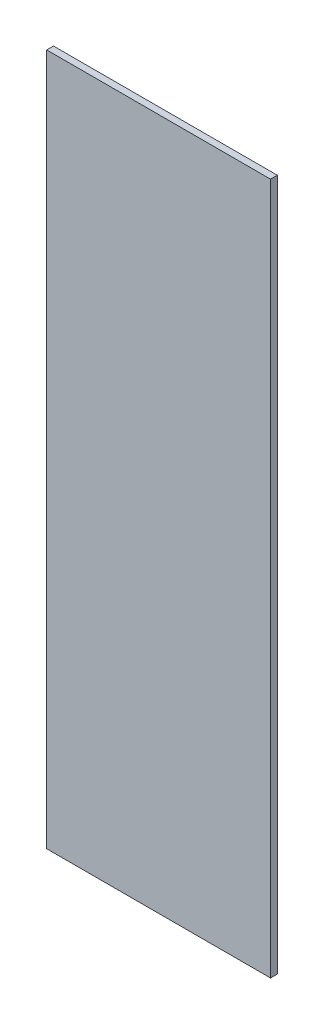
ISO-10303-21;
HEADER;
FILE_DESCRIPTION(('STEP AP214'),'2;1');
FILE_NAME('part.step','',(''),(''),'','','');
FILE_SCHEMA(('AUTOMOTIVE_DESIGN { 1 0 10303 214 1 1 1 1 }'));
ENDSEC;
DATA;
#1=APPLICATION_CONTEXT('core data for automotive mechanical design processes');
#2=APPLICATION_PROTOCOL_DEFINITION('international standard','automotive_design',2000,#1);
#3=PRODUCT_CONTEXT('',#1,'mechanical');
#4=PRODUCT('Part','Part','',(#3));
#5=PRODUCT_RELATED_PRODUCT_CATEGORY('part','',(#4));
#6=PRODUCT_DEFINITION_FORMATION('','',#4);
#7=PRODUCT_DEFINITION_CONTEXT('part definition',#1,'design');
#8=PRODUCT_DEFINITION('design','',#6,#7);
#9=PRODUCT_DEFINITION_SHAPE('','',#8);
#10=(LENGTH_UNIT() NAMED_UNIT(*) SI_UNIT(.MILLI.,.METRE.));
#11=(NAMED_UNIT(*) PLANE_ANGLE_UNIT() SI_UNIT($,.RADIAN.));
#12=(NAMED_UNIT(*) SI_UNIT($,.STERADIAN.) SOLID_ANGLE_UNIT());
#13=UNCERTAINTY_MEASURE_WITH_UNIT(LENGTH_MEASURE(1.E-05),#10,'distance_accuracy_value','');
#14=(GEOMETRIC_REPRESENTATION_CONTEXT(3) GLOBAL_UNCERTAINTY_ASSIGNED_CONTEXT((#13)) GLOBAL_UNIT_ASSIGNED_CONTEXT((#10,
#11,#12)) REPRESENTATION_CONTEXT('',''));
#15=CARTESIAN_POINT('',(0.,0.,0.));
#16=DIRECTION('',(0.,0.,1.));
#17=DIRECTION('',(1.,0.,0.));
#18=AXIS2_PLACEMENT_3D('',#15,#16,#17);
#19=CARTESIAN_POINT('',(1350.,-230.,5.));
#20=DIRECTION('',(-1.,0.,0.));
#21=DIRECTION('',(0.,-1.,0.));
#22=AXIS2_PLACEMENT_3D('',#19,#20,#21);
#23=PLANE('',#22);
#24=DIRECTION('',(0.,1.,0.));
#25=VECTOR('',#24,1.);
#26=CARTESIAN_POINT('',(1350.,-230.,-5.));
#27=LINE('',#26,#25);
#28=CARTESIAN_POINT('',(1350.,-1250.,-5.));
#29=VERTEX_POINT('',#28);
#30=CARTESIAN_POINT('',(1350.,-230.,-5.));
#31=VERTEX_POINT('',#30);
#32=EDGE_CURVE('E102',#29,#31,#27,.T.);
#33=ORIENTED_EDGE('',*,*,#32,.T.);
#34=DIRECTION('',(0.,0.,-1.));
#35=VECTOR('',#34,1.);
#36=CARTESIAN_POINT('',(1350.,-230.,5.));
#37=LINE('',#36,#35);
#38=CARTESIAN_POINT('',(1350.,-230.,5.));
#39=VERTEX_POINT('',#38);
#40=EDGE_CURVE('E11',#39,#31,#37,.T.);
#41=ORIENTED_EDGE('',*,*,#40,.F.);
#42=DIRECTION('',(0.,1.,0.));
#43=VECTOR('',#42,1.);
#44=CARTESIAN_POINT('',(1350.,-230.,5.));
#45=LINE('',#44,#43);
#46=CARTESIAN_POINT('',(1350.,-1250.,5.));
#47=VERTEX_POINT('',#46);
#48=EDGE_CURVE('E90',#47,#39,#45,.T.);
#49=ORIENTED_EDGE('',*,*,#48,.F.);
#50=DIRECTION('',(0.,0.,-1.));
#51=VECTOR('',#50,1.);
#52=CARTESIAN_POINT('',(1350.,-1250.,5.));
#53=LINE('',#52,#51);
#54=EDGE_CURVE('E98',#47,#29,#53,.T.);
#55=ORIENTED_EDGE('',*,*,#54,.T.);
#56=EDGE_LOOP('',(#33,#41,#49,#55));
#57=FACE_BOUND('',#56,.T.);
#58=ADVANCED_FACE('F39',(#57),#23,.F.);
#59=CARTESIAN_POINT('',(1350.,-230.,5.));
#60=DIRECTION('',(0.,-1.,0.));
#61=DIRECTION('',(1.,0.,0.));
#62=AXIS2_PLACEMENT_3D('',#59,#60,#61);
#63=PLANE('',#62);
#64=DIRECTION('',(-1.,0.,0.));
#65=VECTOR('',#64,1.);
#66=CARTESIAN_POINT('',(1350.,-230.,-5.));
#67=LINE('',#66,#65);
#68=CARTESIAN_POINT('',(1020.,-230.,-5.));
#69=VERTEX_POINT('',#68);
#70=EDGE_CURVE('E94',#31,#69,#67,.T.);
#71=ORIENTED_EDGE('',*,*,#70,.T.);
#72=DIRECTION('',(0.,0.,-1.));
#73=VECTOR('',#72,1.);
#74=CARTESIAN_POINT('',(1020.,-230.,5.));
#75=LINE('',#74,#73);
#76=CARTESIAN_POINT('',(1020.,-230.,5.));
#77=VERTEX_POINT('',#76);
#78=EDGE_CURVE('E47',#77,#69,#75,.T.);
#79=ORIENTED_EDGE('',*,*,#78,.F.);
#80=DIRECTION('',(-1.,0.,0.));
#81=VECTOR('',#80,1.);
#82=CARTESIAN_POINT('',(1350.,-230.,5.));
#83=LINE('',#82,#81);
#84=EDGE_CURVE('E85',#39,#77,#83,.T.);
#85=ORIENTED_EDGE('',*,*,#84,.F.);
#86=ORIENTED_EDGE('',*,*,#40,.T.);
#87=EDGE_LOOP('',(#71,#79,#85,#86));
#88=FACE_BOUND('',#87,.T.);
#89=ADVANCED_FACE('F93',(#88),#63,.F.);
#90=CARTESIAN_POINT('',(1020.,-230.,5.));
#91=DIRECTION('',(1.,0.,0.));
#92=DIRECTION('',(0.,1.,0.));
#93=AXIS2_PLACEMENT_3D('',#90,#91,#92);
#94=PLANE('',#93);
#95=DIRECTION('',(0.,-1.,0.));
#96=VECTOR('',#95,1.);
#97=CARTESIAN_POINT('',(1020.,-230.,-5.));
#98=LINE('',#97,#96);
#99=CARTESIAN_POINT('',(1020.,-1250.,-5.));
#100=VERTEX_POINT('',#99);
#101=EDGE_CURVE('E72',#69,#100,#98,.T.);
#102=ORIENTED_EDGE('',*,*,#101,.T.);
#103=DIRECTION('',(0.,0.,-1.));
#104=VECTOR('',#103,1.);
#105=CARTESIAN_POINT('',(1020.,-1250.,5.));
#106=LINE('',#105,#104);
#107=CARTESIAN_POINT('',(1020.,-1250.,5.));
#108=VERTEX_POINT('',#107);
#109=EDGE_CURVE('E95',#108,#100,#106,.T.);
#110=ORIENTED_EDGE('',*,*,#109,.F.);
#111=DIRECTION('',(0.,-1.,0.));
#112=VECTOR('',#111,1.);
#113=CARTESIAN_POINT('',(1020.,-230.,5.));
#114=LINE('',#113,#112);
#115=EDGE_CURVE('E88',#77,#108,#114,.T.);
#116=ORIENTED_EDGE('',*,*,#115,.F.);
#117=ORIENTED_EDGE('',*,*,#78,.T.);
#118=EDGE_LOOP('',(#102,#110,#116,#117));
#119=FACE_BOUND('',#118,.T.);
#120=ADVANCED_FACE('F96',(#119),#94,.F.);
#121=CARTESIAN_POINT('',(1350.,-1250.,5.));
#122=DIRECTION('',(0.,1.,0.));
#123=DIRECTION('',(0.,0.,1.));
#124=AXIS2_PLACEMENT_3D('',#121,#122,#123);
#125=PLANE('',#124);
#126=DIRECTION('',(1.,0.,0.));
#127=VECTOR('',#126,1.);
#128=CARTESIAN_POINT('',(1350.,-1250.,-5.));
#129=LINE('',#128,#127);
#130=EDGE_CURVE('E78',#100,#29,#129,.T.);
#131=ORIENTED_EDGE('',*,*,#130,.T.);
#132=ORIENTED_EDGE('',*,*,#54,.F.);
#133=DIRECTION('',(1.,0.,0.));
#134=VECTOR('',#133,1.);
#135=CARTESIAN_POINT('',(1350.,-1250.,5.));
#136=LINE('',#135,#134);
#137=EDGE_CURVE('E55',#108,#47,#136,.T.);
#138=ORIENTED_EDGE('',*,*,#137,.F.);
#139=ORIENTED_EDGE('',*,*,#109,.T.);
#140=EDGE_LOOP('',(#131,#132,#138,#139));
#141=FACE_BOUND('',#140,.T.);
#142=ADVANCED_FACE('F109',(#141),#125,.F.);
#143=CARTESIAN_POINT('',(0.,0.,5.));
#144=DIRECTION('',(0.,0.,-1.));
#145=DIRECTION('',(-1.,0.,0.));
#146=AXIS2_PLACEMENT_3D('',#143,#144,#145);
#147=PLANE('',#146);
#148=ORIENTED_EDGE('',*,*,#48,.T.);
#149=ORIENTED_EDGE('',*,*,#84,.T.);
#150=ORIENTED_EDGE('',*,*,#115,.T.);
#151=ORIENTED_EDGE('',*,*,#137,.T.);
#152=EDGE_LOOP('',(#148,#149,#150,#151));
#153=FACE_BOUND('',#152,.T.);
#154=ADVANCED_FACE('F86',(#153),#147,.F.);
#155=CARTESIAN_POINT('',(0.,0.,-5.));
#156=DIRECTION('',(0.,0.,-1.));
#157=DIRECTION('',(-1.,0.,0.));
#158=AXIS2_PLACEMENT_3D('',#155,#156,#157);
#159=PLANE('',#158);
#160=ORIENTED_EDGE('',*,*,#32,.F.);
#161=ORIENTED_EDGE('',*,*,#130,.F.);
#162=ORIENTED_EDGE('',*,*,#101,.F.);
#163=ORIENTED_EDGE('',*,*,#70,.F.);
#164=EDGE_LOOP('',(#160,#161,#162,#163));
#165=FACE_BOUND('',#164,.T.);
#166=ADVANCED_FACE('F112',(#165),#159,.T.);
#167=CLOSED_SHELL('',(#58,#89,#120,#142,#154,#166));
#168=MANIFOLD_SOLID_BREP('B2',#167);
#169=ADVANCED_BREP_SHAPE_REPRESENTATION('',(#18,#168),#14);
#170=SHAPE_DEFINITION_REPRESENTATION(#9,#169);
ENDSEC;
END-ISO-10303-21;
